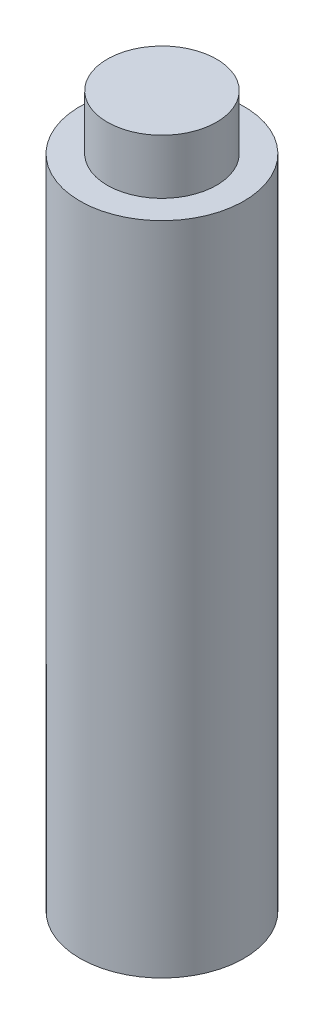
ISO-10303-21;
HEADER;
FILE_DESCRIPTION(('STEP AP214'),'2;1');
FILE_NAME('part.step','',(''),(''),'','','');
FILE_SCHEMA(('AUTOMOTIVE_DESIGN { 1 0 10303 214 1 1 1 1 }'));
ENDSEC;
DATA;
#1=APPLICATION_CONTEXT('core data for automotive mechanical design processes');
#2=APPLICATION_PROTOCOL_DEFINITION('international standard','automotive_design',2000,#1);
#3=PRODUCT_CONTEXT('',#1,'mechanical');
#4=PRODUCT('Part','Part','',(#3));
#5=PRODUCT_RELATED_PRODUCT_CATEGORY('part','',(#4));
#6=PRODUCT_DEFINITION_FORMATION('','',#4);
#7=PRODUCT_DEFINITION_CONTEXT('part definition',#1,'design');
#8=PRODUCT_DEFINITION('design','',#6,#7);
#9=PRODUCT_DEFINITION_SHAPE('','',#8);
#10=(LENGTH_UNIT() NAMED_UNIT(*) SI_UNIT(.MILLI.,.METRE.));
#11=(NAMED_UNIT(*) PLANE_ANGLE_UNIT() SI_UNIT($,.RADIAN.));
#12=(NAMED_UNIT(*) SI_UNIT($,.STERADIAN.) SOLID_ANGLE_UNIT());
#13=UNCERTAINTY_MEASURE_WITH_UNIT(LENGTH_MEASURE(1.E-05),#10,'distance_accuracy_value','');
#14=(GEOMETRIC_REPRESENTATION_CONTEXT(3) GLOBAL_UNCERTAINTY_ASSIGNED_CONTEXT((#13)) GLOBAL_UNIT_ASSIGNED_CONTEXT((#10,
#11,#12)) REPRESENTATION_CONTEXT('',''));
#15=CARTESIAN_POINT('',(0.,0.,0.));
#16=DIRECTION('',(0.,0.,1.));
#17=DIRECTION('',(1.,0.,0.));
#18=AXIS2_PLACEMENT_3D('',#15,#16,#17);
#19=CARTESIAN_POINT('',(0.,60.,0.));
#20=DIRECTION('',(0.,-1.,0.));
#21=DIRECTION('',(0.,0.,-1.));
#22=AXIS2_PLACEMENT_3D('',#19,#20,#21);
#23=CYLINDRICAL_SURFACE('',#22,7.5);
#24=CARTESIAN_POINT('',(0.,60.,0.));
#25=DIRECTION('',(0.,1.,0.));
#26=DIRECTION('',(0.,0.,1.));
#27=AXIS2_PLACEMENT_3D('',#24,#25,#26);
#28=CIRCLE('',#27,7.5);
#29=CARTESIAN_POINT('',(0.,60.,7.5));
#30=VERTEX_POINT('',#29);
#31=EDGE_CURVE('E38',#30,#30,#28,.T.);
#32=ORIENTED_EDGE('',*,*,#31,.F.);
#33=EDGE_LOOP('',(#32));
#34=FACE_BOUND('',#33,.T.);
#35=CARTESIAN_POINT('',(0.,0.,0.));
#36=DIRECTION('',(0.,1.,0.));
#37=DIRECTION('',(0.,0.,1.));
#38=AXIS2_PLACEMENT_3D('',#35,#36,#37);
#39=CIRCLE('',#38,7.5);
#40=CARTESIAN_POINT('',(0.,0.,7.5));
#41=VERTEX_POINT('',#40);
#42=EDGE_CURVE('E34',#41,#41,#39,.T.);
#43=ORIENTED_EDGE('',*,*,#42,.T.);
#44=EDGE_LOOP('',(#43));
#45=FACE_BOUND('',#44,.T.);
#46=ADVANCED_FACE('F31',(#34,#45),#23,.T.);
#47=CARTESIAN_POINT('',(0.,60.,0.));
#48=DIRECTION('',(0.,1.,0.));
#49=DIRECTION('',(0.,0.,1.));
#50=AXIS2_PLACEMENT_3D('',#47,#48,#49);
#51=PLANE('',#50);
#52=CARTESIAN_POINT('',(0.,60.,0.));
#53=DIRECTION('',(0.,1.,0.));
#54=DIRECTION('',(0.,0.,1.));
#55=AXIS2_PLACEMENT_3D('',#52,#53,#54);
#56=CIRCLE('',#55,5.);
#57=CARTESIAN_POINT('',(0.,60.,5.));
#58=VERTEX_POINT('',#57);
#59=EDGE_CURVE('E10',#58,#58,#56,.T.);
#60=ORIENTED_EDGE('',*,*,#59,.F.);
#61=EDGE_LOOP('',(#60));
#62=FACE_BOUND('',#61,.T.);
#63=ORIENTED_EDGE('',*,*,#31,.T.);
#64=EDGE_LOOP('',(#63));
#65=FACE_BOUND('',#64,.T.);
#66=ADVANCED_FACE('F67',(#62,#65),#51,.T.);
#67=CARTESIAN_POINT('',(0.,0.,0.));
#68=DIRECTION('',(0.,1.,0.));
#69=DIRECTION('',(0.,0.,1.));
#70=AXIS2_PLACEMENT_3D('',#67,#68,#69);
#71=PLANE('',#70);
#72=CARTESIAN_POINT('',(0.,0.,0.));
#73=DIRECTION('',(0.,-1.,0.));
#74=DIRECTION('',(0.,0.,-1.));
#75=AXIS2_PLACEMENT_3D('',#72,#73,#74);
#76=CIRCLE('',#75,5.1);
#77=CARTESIAN_POINT('',(0.,0.,-5.1));
#78=VERTEX_POINT('',#77);
#79=EDGE_CURVE('E48',#78,#78,#76,.T.);
#80=ORIENTED_EDGE('',*,*,#79,.F.);
#81=EDGE_LOOP('',(#80));
#82=FACE_BOUND('',#81,.T.);
#83=ORIENTED_EDGE('',*,*,#42,.F.);
#84=EDGE_LOOP('',(#83));
#85=FACE_BOUND('',#84,.T.);
#86=ADVANCED_FACE('F63',(#82,#85),#71,.F.);
#87=CARTESIAN_POINT('',(0.,65.,0.));
#88=DIRECTION('',(0.,-1.,0.));
#89=DIRECTION('',(0.,0.,-1.));
#90=AXIS2_PLACEMENT_3D('',#87,#88,#89);
#91=CYLINDRICAL_SURFACE('',#90,5.);
#92=CARTESIAN_POINT('',(0.,65.,0.));
#93=DIRECTION('',(0.,1.,0.));
#94=DIRECTION('',(0.,0.,1.));
#95=AXIS2_PLACEMENT_3D('',#92,#93,#94);
#96=CIRCLE('',#95,5.);
#97=CARTESIAN_POINT('',(0.,65.,5.));
#98=VERTEX_POINT('',#97);
#99=EDGE_CURVE('E44',#98,#98,#96,.T.);
#100=ORIENTED_EDGE('',*,*,#99,.F.);
#101=EDGE_LOOP('',(#100));
#102=FACE_BOUND('',#101,.T.);
#103=ORIENTED_EDGE('',*,*,#59,.T.);
#104=EDGE_LOOP('',(#103));
#105=FACE_BOUND('',#104,.T.);
#106=ADVANCED_FACE('F66',(#102,#105),#91,.T.);
#107=CARTESIAN_POINT('',(0.,65.,0.));
#108=DIRECTION('',(0.,1.,0.));
#109=DIRECTION('',(0.,0.,1.));
#110=AXIS2_PLACEMENT_3D('',#107,#108,#109);
#111=PLANE('',#110);
#112=ORIENTED_EDGE('',*,*,#99,.T.);
#113=EDGE_LOOP('',(#112));
#114=FACE_BOUND('',#113,.T.);
#115=ADVANCED_FACE('F59',(#114),#111,.T.);
#116=CARTESIAN_POINT('',(0.,5.,0.));
#117=DIRECTION('',(0.,-1.,0.));
#118=DIRECTION('',(0.,0.,-1.));
#119=AXIS2_PLACEMENT_3D('',#116,#117,#118);
#120=CYLINDRICAL_SURFACE('',#119,5.1);
#121=CARTESIAN_POINT('',(0.,5.,0.));
#122=DIRECTION('',(0.,-1.,0.));
#123=DIRECTION('',(0.,0.,-1.));
#124=AXIS2_PLACEMENT_3D('',#121,#122,#123);
#125=CIRCLE('',#124,5.1);
#126=CARTESIAN_POINT('',(0.,5.,-5.1));
#127=VERTEX_POINT('',#126);
#128=EDGE_CURVE('E47',#127,#127,#125,.T.);
#129=ORIENTED_EDGE('',*,*,#128,.F.);
#130=EDGE_LOOP('',(#129));
#131=FACE_BOUND('',#130,.T.);
#132=ORIENTED_EDGE('',*,*,#79,.T.);
#133=EDGE_LOOP('',(#132));
#134=FACE_BOUND('',#133,.T.);
#135=ADVANCED_FACE('F56',(#131,#134),#120,.F.);
#136=CARTESIAN_POINT('',(0.,5.,0.));
#137=DIRECTION('',(0.,-1.,0.));
#138=DIRECTION('',(0.,0.,-1.));
#139=AXIS2_PLACEMENT_3D('',#136,#137,#138);
#140=PLANE('',#139);
#141=ORIENTED_EDGE('',*,*,#128,.T.);
#142=EDGE_LOOP('',(#141));
#143=FACE_BOUND('',#142,.T.);
#144=ADVANCED_FACE('F54',(#143),#140,.T.);
#145=CLOSED_SHELL('',(#46,#66,#86,#106,#115,#135,#144));
#146=MANIFOLD_SOLID_BREP('B2',#145);
#147=ADVANCED_BREP_SHAPE_REPRESENTATION('',(#18,#146),#14);
#148=SHAPE_DEFINITION_REPRESENTATION(#9,#147);
ENDSEC;
END-ISO-10303-21;
